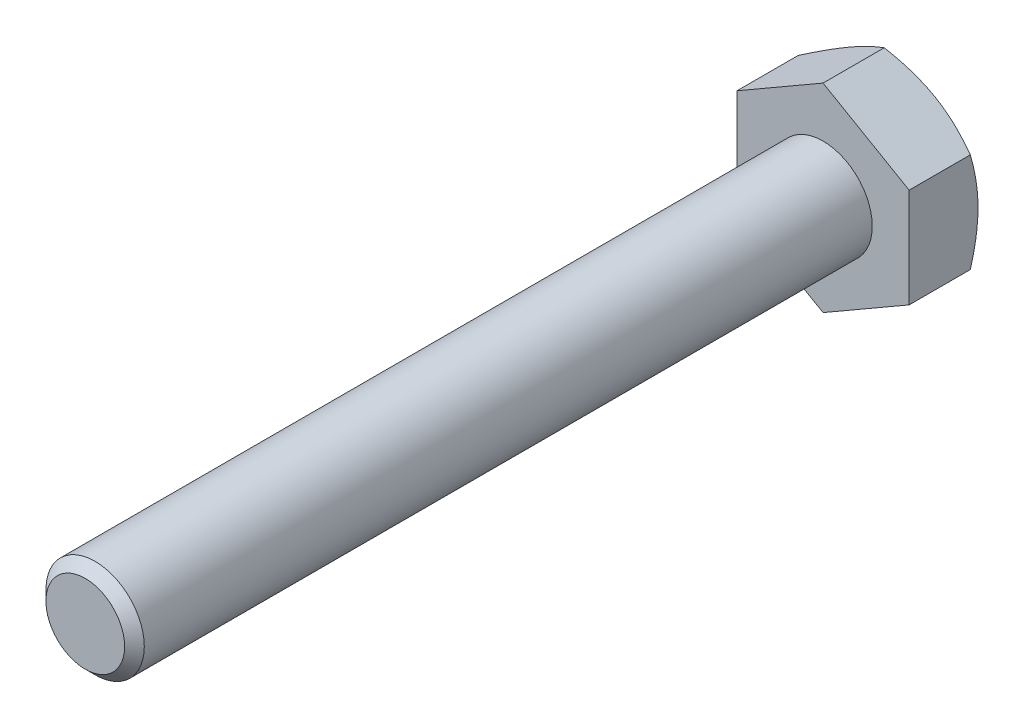
ISO-10303-21;
HEADER;
FILE_DESCRIPTION(('STEP AP214'),'2;1');
FILE_NAME('part.step','',(''),(''),'','','');
FILE_SCHEMA(('AUTOMOTIVE_DESIGN { 1 0 10303 214 1 1 1 1 }'));
ENDSEC;
DATA;
#1=APPLICATION_CONTEXT('core data for automotive mechanical design processes');
#2=APPLICATION_PROTOCOL_DEFINITION('international standard','automotive_design',2000,#1);
#3=PRODUCT_CONTEXT('',#1,'mechanical');
#4=PRODUCT('Part','Part','',(#3));
#5=PRODUCT_RELATED_PRODUCT_CATEGORY('part','',(#4));
#6=PRODUCT_DEFINITION_FORMATION('','',#4);
#7=PRODUCT_DEFINITION_CONTEXT('part definition',#1,'design');
#8=PRODUCT_DEFINITION('design','',#6,#7);
#9=PRODUCT_DEFINITION_SHAPE('','',#8);
#10=(LENGTH_UNIT() NAMED_UNIT(*) SI_UNIT(.MILLI.,.METRE.));
#11=(NAMED_UNIT(*) PLANE_ANGLE_UNIT() SI_UNIT($,.RADIAN.));
#12=(NAMED_UNIT(*) SI_UNIT($,.STERADIAN.) SOLID_ANGLE_UNIT());
#13=UNCERTAINTY_MEASURE_WITH_UNIT(LENGTH_MEASURE(1.E-05),#10,'distance_accuracy_value','');
#14=(GEOMETRIC_REPRESENTATION_CONTEXT(3) GLOBAL_UNCERTAINTY_ASSIGNED_CONTEXT((#13)) GLOBAL_UNIT_ASSIGNED_CONTEXT((#10,
#11,#12)) REPRESENTATION_CONTEXT('',''));
#15=CARTESIAN_POINT('',(0.,0.,0.));
#16=DIRECTION('',(0.,0.,1.));
#17=DIRECTION('',(1.,0.,0.));
#18=AXIS2_PLACEMENT_3D('',#15,#16,#17);
#19=CARTESIAN_POINT('',(0.,0.,30.));
#20=DIRECTION('',(0.,0.,1.));
#21=DIRECTION('',(1.,0.,0.));
#22=AXIS2_PLACEMENT_3D('',#19,#20,#21);
#23=PLANE('',#22);
#24=CARTESIAN_POINT('',(0.,0.,30.));
#25=DIRECTION('',(0.,0.,1.));
#26=DIRECTION('',(1.,0.,0.));
#27=AXIS2_PLACEMENT_3D('',#24,#25,#26);
#28=CIRCLE('',#27,1.6);
#29=CARTESIAN_POINT('',(1.6,0.,30.));
#30=VERTEX_POINT('',#29);
#31=EDGE_CURVE('E269',#30,#30,#28,.T.);
#32=ORIENTED_EDGE('',*,*,#31,.T.);
#33=EDGE_LOOP('',(#32));
#34=FACE_BOUND('',#33,.T.);
#35=ADVANCED_FACE('F32',(#34),#23,.T.);
#36=CARTESIAN_POINT('',(0.,0.,0.));
#37=DIRECTION('',(0.,0.,1.));
#38=DIRECTION('',(1.,0.,0.));
#39=AXIS2_PLACEMENT_3D('',#36,#37,#38);
#40=CYLINDRICAL_SURFACE('',#39,2.);
#41=CARTESIAN_POINT('',(0.,0.,29.6));
#42=DIRECTION('',(0.,0.,1.));
#43=DIRECTION('',(1.,0.,0.));
#44=AXIS2_PLACEMENT_3D('',#41,#42,#43);
#45=CIRCLE('',#44,2.);
#46=CARTESIAN_POINT('',(2.,0.,29.6));
#47=VERTEX_POINT('',#46);
#48=EDGE_CURVE('E240',#47,#47,#45,.F.);
#49=ORIENTED_EDGE('',*,*,#48,.T.);
#50=EDGE_LOOP('',(#49));
#51=FACE_BOUND('',#50,.T.);
#52=CARTESIAN_POINT('',(0.,0.,0.));
#53=DIRECTION('',(0.,0.,1.));
#54=DIRECTION('',(1.,0.,0.));
#55=AXIS2_PLACEMENT_3D('',#52,#53,#54);
#56=CIRCLE('',#55,2.);
#57=CARTESIAN_POINT('',(2.,0.,0.));
#58=VERTEX_POINT('',#57);
#59=EDGE_CURVE('E266',#58,#58,#56,.F.);
#60=ORIENTED_EDGE('',*,*,#59,.F.);
#61=EDGE_LOOP('',(#60));
#62=FACE_BOUND('',#61,.T.);
#63=ADVANCED_FACE('F204',(#51,#62),#40,.T.);
#64=CARTESIAN_POINT('',(0.,0.,30.));
#65=DIRECTION('',(0.,0.,-1.));
#66=DIRECTION('',(-1.,0.,0.));
#67=AXIS2_PLACEMENT_3D('',#64,#65,#66);
#68=CONICAL_SURFACE('',#67,1.6,0.785398163397445);
#69=ORIENTED_EDGE('',*,*,#48,.F.);
#70=EDGE_LOOP('',(#69));
#71=FACE_BOUND('',#70,.T.);
#72=ORIENTED_EDGE('',*,*,#31,.F.);
#73=EDGE_LOOP('',(#72));
#74=FACE_BOUND('',#73,.T.);
#75=ADVANCED_FACE('F34',(#71,#74),#68,.T.);
#76=CARTESIAN_POINT('',(0.,4.04145188432739,-2.8));
#77=DIRECTION('',(0.499999999999998,0.86602540378444,0.));
#78=DIRECTION('',(-0.86602540378444,0.499999999999998,0.));
#79=AXIS2_PLACEMENT_3D('',#76,#77,#78);
#80=PLANE('',#79);
#81=CARTESIAN_POINT('',(-0.000200000000018282,4.04156735438123,-2.48732593930663));
#82=CARTESIAN_POINT('',(0.153607178452432,3.95276673849841,-2.53861421101001));
#83=CARTESIAN_POINT('',(0.308742010834407,3.86319960126199,-2.5852590461838));
#84=CARTESIAN_POINT('',(0.621698006576765,3.68251437287563,-2.66667812446665));
#85=CARTESIAN_POINT('',(0.779524730787481,3.59139307116726,-2.70142356441544));
#86=CARTESIAN_POINT('',(1.09322221038011,3.41027974688035,-2.75550997281716));
#87=CARTESIAN_POINT('',(1.24904469916068,3.32031559103709,-2.77521091373962));
#88=CARTESIAN_POINT('',(1.56142288720536,3.13996396008053,-2.79872986726275));
#89=CARTESIAN_POINT('',(1.71797745103422,3.04957714051107,-2.80256735545444));
#90=CARTESIAN_POINT('',(2.01050921992098,2.88068384499778,-2.79458469812302));
#91=CARTESIAN_POINT('',(2.1465302124579,2.80215208834115,-2.78472456593039));
#92=CARTESIAN_POINT('',(2.41768602028899,2.64560020969754,-2.7534735331006));
#93=CARTESIAN_POINT('',(2.55281989768468,2.56758062920651,-2.7320719567142));
#94=CARTESIAN_POINT('',(2.82453479240518,2.41070596159679,-2.67856959211942));
#95=CARTESIAN_POINT('',(2.96108141927833,2.33187072981464,-2.64624200555491));
#96=CARTESIAN_POINT('',(3.2321380929445,2.17537608630784,-2.57287106619201));
#97=CARTESIAN_POINT('',(3.36665161246854,2.09771466960099,-2.53184495343013));
#98=CARTESIAN_POINT('',(3.5002,2.02061047210986,-2.48732593930663));
#99=B_SPLINE_CURVE_WITH_KNOTS('',3,(#81,#82,#83,#84,#85,#86,#87,#88,#89,#90,#91,#92,#93,#94,#95,
#96,#97,#98),.UNSPECIFIED.,.F.,.F.,(4,2,2,2,2,2,2,2,4),(0.,0.554793832886255,1.11092123814984,
1.65328467083219,2.19498204478404,2.66665130850861,3.13875761298269,3.62133612600511,
4.10296698719189),.UNSPECIFIED.);
#100=CARTESIAN_POINT('',(0.,4.04145188432739,-2.48739260883035));
#101=VERTEX_POINT('',#100);
#102=CARTESIAN_POINT('',(1.74999999999999,3.03108891324554,-2.8));
#103=VERTEX_POINT('',#102);
#104=EDGE_CURVE('E228',#101,#103,#99,.T.);
#105=ORIENTED_EDGE('',*,*,#104,.F.);
#106=DIRECTION('',(0.,0.,1.));
#107=VECTOR('',#106,1.);
#108=CARTESIAN_POINT('',(0.,4.04145188432739,-2.8));
#109=LINE('',#108,#107);
#110=CARTESIAN_POINT('',(0.,4.04145188432739,0.));
#111=VERTEX_POINT('',#110);
#112=EDGE_CURVE('E225',#101,#111,#109,.T.);
#113=ORIENTED_EDGE('',*,*,#112,.T.);
#114=DIRECTION('',(-0.86602540378444,0.499999999999998,0.));
#115=VECTOR('',#114,1.);
#116=CARTESIAN_POINT('',(0.,4.04145188432739,0.));
#117=LINE('',#116,#115);
#118=CARTESIAN_POINT('',(3.5,2.0207259421637,0.));
#119=VERTEX_POINT('',#118);
#120=EDGE_CURVE('E233',#119,#111,#117,.T.);
#121=ORIENTED_EDGE('',*,*,#120,.F.);
#122=DIRECTION('',(0.,0.,1.));
#123=VECTOR('',#122,1.);
#124=CARTESIAN_POINT('',(3.5,2.0207259421637,-2.8));
#125=LINE('',#124,#123);
#126=CARTESIAN_POINT('',(3.5,2.0207259421637,-2.48739260883035));
#127=VERTEX_POINT('',#126);
#128=EDGE_CURVE('E258',#127,#119,#125,.T.);
#129=ORIENTED_EDGE('',*,*,#128,.F.);
#130=EDGE_CURVE('E177',#103,#127,#99,.T.);
#131=ORIENTED_EDGE('',*,*,#130,.F.);
#132=EDGE_LOOP('',(#105,#113,#121,#129,#131));
#133=FACE_BOUND('',#132,.T.);
#134=ADVANCED_FACE('F188',(#133),#80,.T.);
#135=CARTESIAN_POINT('',(3.5,-2.0207259421637,-2.8));
#136=DIRECTION('',(1.,0.,0.));
#137=DIRECTION('',(0.,0.,-1.));
#138=AXIS2_PLACEMENT_3D('',#135,#136,#137);
#139=PLANE('',#138);
#140=CARTESIAN_POINT('',(3.5,-5.5115599132137,-1.05123027842014));
#141=CARTESIAN_POINT('',(3.5,-5.35795146168121,-1.12607664094827));
#142=CARTESIAN_POINT('',(3.5,-5.20399921009229,-1.20022907517413));
#143=CARTESIAN_POINT('',(3.5,-4.89522454872942,-1.34675734914902));
#144=CARTESIAN_POINT('',(3.5,-4.74040201352888,-1.41913292430435));
#145=CARTESIAN_POINT('',(3.5,-4.42894615034129,-1.56206506717812));
#146=CARTESIAN_POINT('',(3.5,-4.27230759822603,-1.63261028917771));
#147=CARTESIAN_POINT('',(3.5,-3.95781335182267,-1.77092284895817));
#148=CARTESIAN_POINT('',(3.5,-3.79995771311103,-1.83869031269911));
#149=CARTESIAN_POINT('',(3.5,-3.47741113153966,-1.97295074269912));
#150=CARTESIAN_POINT('',(3.5,-3.31266966015408,-2.03932296039635));
#151=CARTESIAN_POINT('',(3.5,-2.98129055183975,-2.16724360933954));
#152=CARTESIAN_POINT('',(3.5,-2.81465270912935,-2.22879151125521));
#153=CARTESIAN_POINT('',(3.5,-2.47950135030689,-2.34550906477687));
#154=CARTESIAN_POINT('',(3.5,-2.31099212862996,-2.40069092778852));
#155=CARTESIAN_POINT('',(3.5,-1.9715578800388,-2.50296137699356));
#156=CARTESIAN_POINT('',(3.5,-1.80063360505408,-2.55005242468974));
#157=CARTESIAN_POINT('',(3.5,-1.45721769418154,-2.63368726814516));
#158=CARTESIAN_POINT('',(3.5,-1.284740691287,-2.67029006719255));
#159=CARTESIAN_POINT('',(3.5,-0.937557025087316,-2.73093355614778));
#160=CARTESIAN_POINT('',(3.5,-0.762850606367499,-2.75497561213941));
#161=CARTESIAN_POINT('',(3.5,-0.41439625684188,-2.78826920086828));
#162=CARTESIAN_POINT('',(3.5,-0.24066759256781,-2.79771739417793));
#163=CARTESIAN_POINT('',(3.5,0.106974360360036,-2.80154556659445));
#164=CARTESIAN_POINT('',(3.5,0.280887651698044,-2.7959253235422));
#165=CARTESIAN_POINT('',(3.5,0.57367772999446,-2.77418399451728));
#166=CARTESIAN_POINT('',(3.5,0.692856453275199,-2.76187051371579));
#167=CARTESIAN_POINT('',(3.5,0.930390570440087,-2.73088957270953));
#168=CARTESIAN_POINT('',(3.5,1.04874585973469,-2.71222131985519));
#169=CARTESIAN_POINT('',(3.5,1.40238821087656,-2.64766060469304));
#170=CARTESIAN_POINT('',(3.5,1.636135180366,-2.59322203585637));
#171=CARTESIAN_POINT('',(3.5,1.98584040729011,-2.49818174698124));
#172=CARTESIAN_POINT('',(3.5,2.10359260573205,-2.46379952268766));
#173=CARTESIAN_POINT('',(3.5,2.3379545290403,-2.39130577472369));
#174=CARTESIAN_POINT('',(3.5,2.45456424508592,-2.35319422228545));
#175=CARTESIAN_POINT('',(3.5,2.68667648503228,-2.27386649986118));
#176=CARTESIAN_POINT('',(3.5,2.80217931014601,-2.23265120318029));
#177=CARTESIAN_POINT('',(3.5,3.0322162217769,-2.14761668191578));
#178=CARTESIAN_POINT('',(3.5,3.14675033047978,-2.10379751715191));
#179=CARTESIAN_POINT('',(3.5,3.45518824474215,-1.98241358076653));
#180=CARTESIAN_POINT('',(3.5,3.64827858337665,-1.90278371704724));
#181=CARTESIAN_POINT('',(3.5,4.03246733734996,-1.738838783469));
#182=CARTESIAN_POINT('',(3.5,4.22356552793095,-1.6545231916082));
#183=CARTESIAN_POINT('',(3.5,4.60422080078615,-1.48231977624898));
#184=CARTESIAN_POINT('',(3.5,4.79377731975278,-1.3944307117281));
#185=CARTESIAN_POINT('',(3.5,5.17160542987793,-1.21592705795529));
#186=CARTESIAN_POINT('',(3.5,5.35987698121651,-1.12531238470558));
#187=CARTESIAN_POINT('',(3.5,5.73567568183911,-0.941812491523437));
#188=CARTESIAN_POINT('',(3.5,5.92320119040395,-0.848923918398865));
#189=CARTESIAN_POINT('',(3.5,6.29740401332882,-0.661451949679656));
#190=CARTESIAN_POINT('',(3.5,6.4840813186156,-0.566868536008528));
#191=CARTESIAN_POINT('',(3.5,7.04299370579127,-0.281137350976761));
#192=CARTESIAN_POINT('',(3.5,7.41419418594083,-0.0879667587069206));
#193=CARTESIAN_POINT('',(3.5,8.1154529737333,0.28131090771229));
#194=CARTESIAN_POINT('',(3.5,8.44570240603792,0.457056799003233));
#195=CARTESIAN_POINT('',(3.5,9.10509095269334,0.810667080198443));
#196=CARTESIAN_POINT('',(3.5,9.4342299968145,0.988531600993423));
#197=CARTESIAN_POINT('',(3.5,10.0905480448887,1.34522643131465));
#198=CARTESIAN_POINT('',(3.5,10.4177299168719,1.52405147197681));
#199=CARTESIAN_POINT('',(3.5,11.0714005801046,1.88290305302714));
#200=CARTESIAN_POINT('',(3.5,11.397889424295,2.06292949694077));
#201=CARTESIAN_POINT('',(3.5,11.7241348717818,2.24339321716844));
#202=B_SPLINE_CURVE_WITH_KNOTS('',3,(#140,#141,#142,#143,#144,#145,#146,#147,#148,#149,#150,
#151,#152,#153,#154,#155,#156,#157,#158,#159,#160,#161,#162,#163,#164,#165,#166,#167,#168,#169,
#170,#171,#172,#173,#174,#175,#176,#177,#178,#179,#180,#181,#182,#183,#184,#185,#186,#187,#188,
#189,#190,#191,#192,#193,#194,#195,#196,#197,#198,#199,#200,#201),.UNSPECIFIED.,.F.,.F.,(4,2,2,
2,2,2,2,2,2,2,2,2,2,2,2,2,2,2,2,2,2,2,2,2,2,2,2,2,2,2,4),(0.,0.512624455055139,1.02532478807014,
1.54067716579031,2.05600614845994,2.58877526662743,3.12160275933497,3.65339055670451,
4.18501627844404,4.71358974605645,5.24210571499797,5.76343550148058,6.28477297414903,
6.64403977227188,7.00335139923845,7.72232402023062,8.09029789782061,8.45827461416728,
8.82614817645966,9.19401329070559,9.82051720102626,10.4470910459092,11.0738843824793,
11.7006970553932,12.3284975462801,12.9563047370264,14.2116350789245,15.333929259245,
16.4562931392235,17.5748776783279,18.6933734490332),.UNSPECIFIED.);
#203=CARTESIAN_POINT('',(3.5,0.,-2.8));
#204=VERTEX_POINT('',#203);
#205=EDGE_CURVE('E175',#127,#204,#202,.F.);
#206=ORIENTED_EDGE('',*,*,#205,.F.);
#207=ORIENTED_EDGE('',*,*,#128,.T.);
#208=DIRECTION('',(0.,1.,0.));
#209=VECTOR('',#208,1.);
#210=CARTESIAN_POINT('',(3.5,-2.0207259421637,0.));
#211=LINE('',#210,#209);
#212=CARTESIAN_POINT('',(3.5,-2.0207259421637,0.));
#213=VERTEX_POINT('',#212);
#214=EDGE_CURVE('E265',#213,#119,#211,.T.);
#215=ORIENTED_EDGE('',*,*,#214,.F.);
#216=DIRECTION('',(0.,0.,1.));
#217=VECTOR('',#216,1.);
#218=CARTESIAN_POINT('',(3.5,-2.0207259421637,-2.8));
#219=LINE('',#218,#217);
#220=CARTESIAN_POINT('',(3.5,-2.0207259421637,-2.48739260883036));
#221=VERTEX_POINT('',#220);
#222=EDGE_CURVE('E243',#221,#213,#219,.T.);
#223=ORIENTED_EDGE('',*,*,#222,.F.);
#224=EDGE_CURVE('E169',#204,#221,#202,.F.);
#225=ORIENTED_EDGE('',*,*,#224,.F.);
#226=EDGE_LOOP('',(#206,#207,#215,#223,#225));
#227=FACE_BOUND('',#226,.T.);
#228=ADVANCED_FACE('F184',(#227),#139,.T.);
#229=CARTESIAN_POINT('',(0.,-4.04145188432739,-2.8));
#230=DIRECTION('',(0.499999999999998,-0.86602540378444,0.));
#231=DIRECTION('',(0.86602540378444,0.499999999999998,0.));
#232=AXIS2_PLACEMENT_3D('',#229,#230,#231);
#233=PLANE('',#232);
#234=CARTESIAN_POINT('',(3.5002,-2.02061047210986,-2.48732593930663));
#235=CARTESIAN_POINT('',(3.34639282154755,-2.10941108799268,-2.53861421101002));
#236=CARTESIAN_POINT('',(3.19125798916558,-2.1989782252291,-2.5852590461838));
#237=CARTESIAN_POINT('',(2.87830199342322,-2.37966345361546,-2.66667812446665));
#238=CARTESIAN_POINT('',(2.7204752692125,-2.47078475532383,-2.70142356441544));
#239=CARTESIAN_POINT('',(2.40677778961987,-2.65189807961074,-2.75550997281716));
#240=CARTESIAN_POINT('',(2.25095530083931,-2.741862235454,-2.77521091373962));
#241=CARTESIAN_POINT('',(1.93857711279462,-2.92221386641056,-2.79872986726275));
#242=CARTESIAN_POINT('',(1.78202254896577,-3.01260068598002,-2.80256735545444));
#243=CARTESIAN_POINT('',(1.48949078007901,-3.1814939814933,-2.79458469812302));
#244=CARTESIAN_POINT('',(1.35346978754209,-3.26002573814993,-2.78472456593039));
#245=CARTESIAN_POINT('',(1.082313979711,-3.41657761679354,-2.7534735331006));
#246=CARTESIAN_POINT('',(0.947180102315307,-3.49459719728458,-2.7320719567142));
#247=CARTESIAN_POINT('',(0.675465207594804,-3.65147186489429,-2.67856959211942));
#248=CARTESIAN_POINT('',(0.538918580721651,-3.73030709667644,-2.64624200555491));
#249=CARTESIAN_POINT('',(0.267861907055482,-3.88680174018325,-2.572871066192));
#250=CARTESIAN_POINT('',(0.133348387531446,-3.9644631568901,-2.53184495343013));
#251=CARTESIAN_POINT('',(-0.00020000000001818,-4.04156735438123,-2.48732593930663));
#252=B_SPLINE_CURVE_WITH_KNOTS('',3,(#234,#235,#236,#237,#238,#239,#240,#241,#242,#243,#244,
#245,#246,#247,#248,#249,#250,#251),.UNSPECIFIED.,.F.,.F.,(4,2,2,2,2,2,2,2,4),(0.,
0.554793832886255,1.11092123814984,1.65328467083219,2.19498204478404,2.66665130850861,
3.13875761298269,3.62133612600511,4.10296698719189),.UNSPECIFIED.);
#253=CARTESIAN_POINT('',(1.74999999999999,-3.03108891324554,-2.8));
#254=VERTEX_POINT('',#253);
#255=EDGE_CURVE('E176',#221,#254,#252,.T.);
#256=ORIENTED_EDGE('',*,*,#255,.F.);
#257=ORIENTED_EDGE('',*,*,#222,.T.);
#258=DIRECTION('',(0.86602540378444,0.499999999999998,0.));
#259=VECTOR('',#258,1.);
#260=CARTESIAN_POINT('',(0.,-4.04145188432739,0.));
#261=LINE('',#260,#259);
#262=CARTESIAN_POINT('',(0.,-4.04145188432739,0.));
#263=VERTEX_POINT('',#262);
#264=EDGE_CURVE('E254',#263,#213,#261,.T.);
#265=ORIENTED_EDGE('',*,*,#264,.F.);
#266=DIRECTION('',(0.,0.,1.));
#267=VECTOR('',#266,1.);
#268=CARTESIAN_POINT('',(0.,-4.04145188432739,-2.8));
#269=LINE('',#268,#267);
#270=CARTESIAN_POINT('',(0.,-4.04145188432739,-2.48739260883035));
#271=VERTEX_POINT('',#270);
#272=EDGE_CURVE('E253',#271,#263,#269,.T.);
#273=ORIENTED_EDGE('',*,*,#272,.F.);
#274=EDGE_CURVE('E162',#254,#271,#252,.T.);
#275=ORIENTED_EDGE('',*,*,#274,.F.);
#276=EDGE_LOOP('',(#256,#257,#265,#273,#275));
#277=FACE_BOUND('',#276,.T.);
#278=ADVANCED_FACE('F187',(#277),#233,.T.);
#279=CARTESIAN_POINT('',(0.,-4.04145188432739,-2.8));
#280=DIRECTION('',(-0.500000000000002,-0.866025403784438,0.));
#281=DIRECTION('',(0.866025403784438,-0.500000000000002,0.));
#282=AXIS2_PLACEMENT_3D('',#279,#280,#281);
#283=PLANE('',#282);
#284=CARTESIAN_POINT('',(0.000199999999981852,-4.04156735438123,-2.48732593930663));
#285=CARTESIAN_POINT('',(-0.153607178452468,-3.95276673849841,-2.53861421101001));
#286=CARTESIAN_POINT('',(-0.308742010834443,-3.86319960126199,-2.5852590461838));
#287=CARTESIAN_POINT('',(-0.621698006576801,-3.68251437287563,-2.66667812446665));
#288=CARTESIAN_POINT('',(-0.779524730787515,-3.59139307116725,-2.70142356441544));
#289=CARTESIAN_POINT('',(-1.09322221038015,-3.41027974688034,-2.75550997281716));
#290=CARTESIAN_POINT('',(-1.24904469916071,-3.32031559103708,-2.77521091373962));
#291=CARTESIAN_POINT('',(-1.56142288720539,-3.13996396008052,-2.79872986726274));
#292=CARTESIAN_POINT('',(-1.71797745103425,-3.04957714051106,-2.80256735545443));
#293=CARTESIAN_POINT('',(-2.01050921992101,-2.88068384499777,-2.79458469812302));
#294=CARTESIAN_POINT('',(-2.14653021245793,-2.80215208834115,-2.78472456593039));
#295=CARTESIAN_POINT('',(-2.41768602028901,-2.64560020969754,-2.75347353310059));
#296=CARTESIAN_POINT('',(-2.5528198976847,-2.5675806292065,-2.7320719567142));
#297=CARTESIAN_POINT('',(-2.8245347924052,-2.41070596159679,-2.67856959211942));
#298=CARTESIAN_POINT('',(-2.96108141927835,-2.33187072981464,-2.64624200555491));
#299=CARTESIAN_POINT('',(-3.23213809294451,-2.17537608630784,-2.572871066192));
#300=CARTESIAN_POINT('',(-3.36665161246854,-2.09771466960099,-2.53184495343013));
#301=CARTESIAN_POINT('',(-3.5002,-2.02061047210986,-2.48732593930663));
#302=B_SPLINE_CURVE_WITH_KNOTS('',3,(#284,#285,#286,#287,#288,#289,#290,#291,#292,#293,#294,
#295,#296,#297,#298,#299,#300,#301),.UNSPECIFIED.,.F.,.F.,(4,2,2,2,2,2,2,2,4),(0.,
0.554793832886255,1.11092123814984,1.65328467083219,2.19498204478404,2.6666513085086,
3.13875761298267,3.62133612600509,4.10296698719186),.UNSPECIFIED.);
#303=CARTESIAN_POINT('',(-1.75000000000001,-3.03108891324553,-2.8));
#304=VERTEX_POINT('',#303);
#305=EDGE_CURVE('E249',#271,#304,#302,.T.);
#306=ORIENTED_EDGE('',*,*,#305,.F.);
#307=ORIENTED_EDGE('',*,*,#272,.T.);
#308=DIRECTION('',(0.866025403784438,-0.500000000000002,0.));
#309=VECTOR('',#308,1.);
#310=CARTESIAN_POINT('',(0.,-4.04145188432739,0.));
#311=LINE('',#310,#309);
#312=CARTESIAN_POINT('',(-3.5,-2.0207259421637,0.));
#313=VERTEX_POINT('',#312);
#314=EDGE_CURVE('E387',#313,#263,#311,.T.);
#315=ORIENTED_EDGE('',*,*,#314,.F.);
#316=DIRECTION('',(0.,0.,1.));
#317=VECTOR('',#316,1.);
#318=CARTESIAN_POINT('',(-3.5,-2.0207259421637,-2.8));
#319=LINE('',#318,#317);
#320=CARTESIAN_POINT('',(-3.5,-2.02072594216386,-2.48739260883046));
#321=VERTEX_POINT('',#320);
#322=EDGE_CURVE('E256',#321,#313,#319,.T.);
#323=ORIENTED_EDGE('',*,*,#322,.F.);
#324=EDGE_CURVE('E109',#304,#321,#302,.T.);
#325=ORIENTED_EDGE('',*,*,#324,.F.);
#326=EDGE_LOOP('',(#306,#307,#315,#323,#325));
#327=FACE_BOUND('',#326,.T.);
#328=ADVANCED_FACE('F193',(#327),#283,.T.);
#329=CARTESIAN_POINT('',(-3.5,-2.0207259421637,-2.8));
#330=DIRECTION('',(-1.,0.,0.));
#331=DIRECTION('',(0.,0.,1.));
#332=AXIS2_PLACEMENT_3D('',#329,#330,#331);
#333=PLANE('',#332);
#334=CARTESIAN_POINT('',(-3.5,-5.5115599132137,-1.05123027842014));
#335=CARTESIAN_POINT('',(-3.5,-5.35795146168121,-1.12607664094827));
#336=CARTESIAN_POINT('',(-3.5,-5.20399921009229,-1.20022907517413));
#337=CARTESIAN_POINT('',(-3.5,-4.89522454872942,-1.34675734914902));
#338=CARTESIAN_POINT('',(-3.5,-4.74040201352888,-1.41913292430435));
#339=CARTESIAN_POINT('',(-3.5,-4.42894615034129,-1.56206506717813));
#340=CARTESIAN_POINT('',(-3.5,-4.27230759822603,-1.63261028917771));
#341=CARTESIAN_POINT('',(-3.5,-3.95781335182267,-1.77092284895817));
#342=CARTESIAN_POINT('',(-3.5,-3.79995771311103,-1.83869031269911));
#343=CARTESIAN_POINT('',(-3.5,-3.47741113153966,-1.97295074269912));
#344=CARTESIAN_POINT('',(-3.5,-3.31266966015408,-2.03932296039635));
#345=CARTESIAN_POINT('',(-3.5,-2.98129055183975,-2.16724360933954));
#346=CARTESIAN_POINT('',(-3.5,-2.81465270912935,-2.22879151125521));
#347=CARTESIAN_POINT('',(-3.5,-2.47950135030689,-2.34550906477687));
#348=CARTESIAN_POINT('',(-3.5,-2.31099212862996,-2.40069092778851));
#349=CARTESIAN_POINT('',(-3.5,-1.9715578800388,-2.50296137699356));
#350=CARTESIAN_POINT('',(-3.5,-1.80063360505408,-2.55005242468974));
#351=CARTESIAN_POINT('',(-3.5,-1.45721769418154,-2.63368726814516));
#352=CARTESIAN_POINT('',(-3.5,-1.284740691287,-2.67029006719254));
#353=CARTESIAN_POINT('',(-3.5,-0.937557025087316,-2.73093355614778));
#354=CARTESIAN_POINT('',(-3.5,-0.7628506063675,-2.75497561213941));
#355=CARTESIAN_POINT('',(-3.5,-0.41439625684188,-2.78826920086828));
#356=CARTESIAN_POINT('',(-3.5,-0.240667592567811,-2.79771739417793));
#357=CARTESIAN_POINT('',(-3.5,0.106974360360035,-2.80154556659445));
#358=CARTESIAN_POINT('',(-3.5,0.280887651698044,-2.7959253235422));
#359=CARTESIAN_POINT('',(-3.5,0.573677729994459,-2.77418399451728));
#360=CARTESIAN_POINT('',(-3.5,0.692856453275198,-2.76187051371579));
#361=CARTESIAN_POINT('',(-3.5,0.930390570440087,-2.73088957270953));
#362=CARTESIAN_POINT('',(-3.5,1.04874585973469,-2.71222131985519));
#363=CARTESIAN_POINT('',(-3.5,1.40238821087656,-2.64766060469304));
#364=CARTESIAN_POINT('',(-3.5,1.636135180366,-2.59322203585637));
#365=CARTESIAN_POINT('',(-3.5,1.98584040729011,-2.49818174698124));
#366=CARTESIAN_POINT('',(-3.5,2.10359260573205,-2.46379952268766));
#367=CARTESIAN_POINT('',(-3.5,2.3379545290403,-2.39130577472369));
#368=CARTESIAN_POINT('',(-3.5,2.45456424508592,-2.35319422228545));
#369=CARTESIAN_POINT('',(-3.5,2.68667648503228,-2.27386649986119));
#370=CARTESIAN_POINT('',(-3.5,2.80217931014601,-2.23265120318029));
#371=CARTESIAN_POINT('',(-3.5,3.0322162217769,-2.14761668191579));
#372=CARTESIAN_POINT('',(-3.5,3.14675033047978,-2.10379751715191));
#373=CARTESIAN_POINT('',(-3.5,3.45518824474215,-1.98241358076653));
#374=CARTESIAN_POINT('',(-3.5,3.64827858337665,-1.90278371704724));
#375=CARTESIAN_POINT('',(-3.5,4.03246733734996,-1.738838783469));
#376=CARTESIAN_POINT('',(-3.5,4.22356552793095,-1.6545231916082));
#377=CARTESIAN_POINT('',(-3.5,4.60422080078615,-1.48231977624898));
#378=CARTESIAN_POINT('',(-3.5,4.79377731975278,-1.3944307117281));
#379=CARTESIAN_POINT('',(-3.5,5.17160542987793,-1.21592705795529));
#380=CARTESIAN_POINT('',(-3.5,5.3598769812165,-1.12531238470558));
#381=CARTESIAN_POINT('',(-3.5,5.7356756818391,-0.941812491523439));
#382=CARTESIAN_POINT('',(-3.5,5.92320119040394,-0.848923918398866));
#383=CARTESIAN_POINT('',(-3.5,6.29740401332881,-0.661451949679658));
#384=CARTESIAN_POINT('',(-3.5,6.4840813186156,-0.566868536008529));
#385=CARTESIAN_POINT('',(-3.5,7.04299370579126,-0.281137350976762));
#386=CARTESIAN_POINT('',(-3.5,7.41419418594082,-0.0879667587069218));
#387=CARTESIAN_POINT('',(-3.5,8.1154529737333,0.281310907712289));
#388=CARTESIAN_POINT('',(-3.5,8.44570240603792,0.457056799003232));
#389=CARTESIAN_POINT('',(-3.5,9.10509095269334,0.810667080198443));
#390=CARTESIAN_POINT('',(-3.5,9.4342299968145,0.988531600993422));
#391=CARTESIAN_POINT('',(-3.5,10.0905480448887,1.34522643131465));
#392=CARTESIAN_POINT('',(-3.5,10.4177299168718,1.52405147197681));
#393=CARTESIAN_POINT('',(-3.5,11.0714005801046,1.88290305302714));
#394=CARTESIAN_POINT('',(-3.5,11.397889424295,2.06292949694077));
#395=CARTESIAN_POINT('',(-3.5,11.7241348717818,2.24339321716844));
#396=B_SPLINE_CURVE_WITH_KNOTS('',3,(#334,#335,#336,#337,#338,#339,#340,#341,#342,#343,#344,
#345,#346,#347,#348,#349,#350,#351,#352,#353,#354,#355,#356,#357,#358,#359,#360,#361,#362,#363,
#364,#365,#366,#367,#368,#369,#370,#371,#372,#373,#374,#375,#376,#377,#378,#379,#380,#381,#382,
#383,#384,#385,#386,#387,#388,#389,#390,#391,#392,#393,#394,#395),.UNSPECIFIED.,.F.,.F.,(4,2,2,
2,2,2,2,2,2,2,2,2,2,2,2,2,2,2,2,2,2,2,2,2,2,2,2,2,2,2,4),(0.,0.51262445505514,1.02532478807014,
1.54067716579031,2.05600614845994,2.58877526662743,3.12160275933497,3.65339055670451,
4.18501627844404,4.71358974605645,5.24210571499797,5.76343550148057,6.28477297414903,
6.64403977227187,7.00335139923845,7.72232402023061,8.0902978978206,8.45827461416728,
8.82614817645965,9.19401329070559,9.82051720102626,10.4470910459092,11.0738843824793,
11.7006970553932,12.3284975462801,12.9563047370264,14.2116350789245,15.333929259245,
16.4562931392235,17.5748776783279,18.6933734490332),.UNSPECIFIED.);
#397=CARTESIAN_POINT('',(-3.5,0.,-2.8));
#398=VERTEX_POINT('',#397);
#399=EDGE_CURVE('E104',#321,#398,#396,.T.);
#400=ORIENTED_EDGE('',*,*,#399,.F.);
#401=ORIENTED_EDGE('',*,*,#322,.T.);
#402=DIRECTION('',(0.,-1.,0.));
#403=VECTOR('',#402,1.);
#404=CARTESIAN_POINT('',(-3.5,-2.0207259421637,0.));
#405=LINE('',#404,#403);
#406=CARTESIAN_POINT('',(-3.5,2.0207259421637,0.));
#407=VERTEX_POINT('',#406);
#408=EDGE_CURVE('E389',#407,#313,#405,.T.);
#409=ORIENTED_EDGE('',*,*,#408,.F.);
#410=DIRECTION('',(0.,0.,1.));
#411=VECTOR('',#410,1.);
#412=CARTESIAN_POINT('',(-3.5,2.0207259421637,-2.8));
#413=LINE('',#412,#411);
#414=CARTESIAN_POINT('',(-3.5,2.0207259421637,-2.48739260883035));
#415=VERTEX_POINT('',#414);
#416=EDGE_CURVE('E130',#415,#407,#413,.T.);
#417=ORIENTED_EDGE('',*,*,#416,.F.);
#418=EDGE_CURVE('E113',#398,#415,#396,.T.);
#419=ORIENTED_EDGE('',*,*,#418,.F.);
#420=EDGE_LOOP('',(#400,#401,#409,#417,#419));
#421=FACE_BOUND('',#420,.T.);
#422=ADVANCED_FACE('F128',(#421),#333,.T.);
#423=CARTESIAN_POINT('',(-3.5,2.0207259421637,-2.8));
#424=DIRECTION('',(-0.500000000000002,0.866025403784438,0.));
#425=DIRECTION('',(-0.866025403784438,-0.500000000000002,0.));
#426=AXIS2_PLACEMENT_3D('',#423,#424,#425);
#427=PLANE('',#426);
#428=CARTESIAN_POINT('',(-3.5002,2.02061047210986,-2.48732593930663));
#429=CARTESIAN_POINT('',(-3.34639282154755,2.10941108799268,-2.53861421101001));
#430=CARTESIAN_POINT('',(-3.19125798916558,2.1989782252291,-2.5852590461838));
#431=CARTESIAN_POINT('',(-2.87830199342322,2.37966345361546,-2.66667812446665));
#432=CARTESIAN_POINT('',(-2.72047526921251,2.47078475532383,-2.70142356441544));
#433=CARTESIAN_POINT('',(-2.40677778961987,2.65189807961075,-2.75550997281716));
#434=CARTESIAN_POINT('',(-2.25095530083931,2.741862235454,-2.77521091373962));
#435=CARTESIAN_POINT('',(-1.93857711279463,2.92221386641057,-2.79872986726274));
#436=CARTESIAN_POINT('',(-1.78202254896577,3.01260068598002,-2.80256735545443));
#437=CARTESIAN_POINT('',(-1.48949078007901,3.18149398149331,-2.79458469812302));
#438=CARTESIAN_POINT('',(-1.3534697875421,3.26002573814994,-2.78472456593039));
#439=CARTESIAN_POINT('',(-1.08231397971101,3.41657761679355,-2.75347353310059));
#440=CARTESIAN_POINT('',(-0.947180102315325,3.49459719728459,-2.7320719567142));
#441=CARTESIAN_POINT('',(-0.675465207594827,3.6514718648943,-2.67856959211942));
#442=CARTESIAN_POINT('',(-0.538918580721677,3.73030709667645,-2.64624200555491));
#443=CARTESIAN_POINT('',(-0.267861907055514,3.88680174018325,-2.572871066192));
#444=CARTESIAN_POINT('',(-0.13334838753148,3.9644631568901,-2.53184495343013));
#445=CARTESIAN_POINT('',(0.000199999999981511,4.04156735438123,-2.48732593930663));
#446=B_SPLINE_CURVE_WITH_KNOTS('',3,(#428,#429,#430,#431,#432,#433,#434,#435,#436,#437,#438,
#439,#440,#441,#442,#443,#444,#445),.UNSPECIFIED.,.F.,.F.,(4,2,2,2,2,2,2,2,4),(0.,
0.554793832886256,1.11092123814984,1.65328467083219,2.19498204478403,2.6666513085086,
3.13875761298267,3.62133612600509,4.10296698719186),.UNSPECIFIED.);
#447=CARTESIAN_POINT('',(-1.75000000000001,3.03108891324554,-2.8));
#448=VERTEX_POINT('',#447);
#449=EDGE_CURVE('E119',#415,#448,#446,.T.);
#450=ORIENTED_EDGE('',*,*,#449,.F.);
#451=ORIENTED_EDGE('',*,*,#416,.T.);
#452=DIRECTION('',(-0.866025403784438,-0.500000000000002,0.));
#453=VECTOR('',#452,1.);
#454=CARTESIAN_POINT('',(-3.5,2.0207259421637,0.));
#455=LINE('',#454,#453);
#456=EDGE_CURVE('E235',#111,#407,#455,.T.);
#457=ORIENTED_EDGE('',*,*,#456,.F.);
#458=ORIENTED_EDGE('',*,*,#112,.F.);
#459=EDGE_CURVE('E121',#448,#101,#446,.T.);
#460=ORIENTED_EDGE('',*,*,#459,.F.);
#461=EDGE_LOOP('',(#450,#451,#457,#458,#460));
#462=FACE_BOUND('',#461,.T.);
#463=ADVANCED_FACE('F201',(#462),#427,.T.);
#464=CARTESIAN_POINT('',(3.5,2.0207259421637,0.));
#465=DIRECTION('',(0.,0.,1.));
#466=DIRECTION('',(1.,0.,0.));
#467=AXIS2_PLACEMENT_3D('',#464,#465,#466);
#468=PLANE('',#467);
#469=ORIENTED_EDGE('',*,*,#59,.T.);
#470=EDGE_LOOP('',(#469));
#471=FACE_BOUND('',#470,.T.);
#472=ORIENTED_EDGE('',*,*,#120,.T.);
#473=ORIENTED_EDGE('',*,*,#456,.T.);
#474=ORIENTED_EDGE('',*,*,#408,.T.);
#475=ORIENTED_EDGE('',*,*,#314,.T.);
#476=ORIENTED_EDGE('',*,*,#264,.T.);
#477=ORIENTED_EDGE('',*,*,#214,.T.);
#478=EDGE_LOOP('',(#472,#473,#474,#475,#476,#477));
#479=FACE_BOUND('',#478,.T.);
#480=ADVANCED_FACE('F190',(#471,#479),#468,.T.);
#481=CARTESIAN_POINT('',(0.,0.,0.));
#482=DIRECTION('',(0.,0.,1.));
#483=DIRECTION('',(1.,0.,0.));
#484=AXIS2_PLACEMENT_3D('',#481,#482,#483);
#485=CONICAL_SURFACE('',#484,8.34974226119285,1.0471975511966);
#486=ORIENTED_EDGE('',*,*,#130,.T.);
#487=ORIENTED_EDGE('',*,*,#205,.T.);
#488=CARTESIAN_POINT('',(0.,0.,-2.8));
#489=DIRECTION('',(0.,0.,1.));
#490=DIRECTION('',(1.,0.,0.));
#491=AXIS2_PLACEMENT_3D('',#488,#489,#490);
#492=CIRCLE('',#491,3.5);
#493=EDGE_CURVE('E36',#103,#204,#492,.F.);
#494=ORIENTED_EDGE('',*,*,#493,.F.);
#495=EDGE_LOOP('',(#486,#487,#494));
#496=FACE_BOUND('',#495,.T.);
#497=ADVANCED_FACE('F221',(#496),#485,.T.);
#498=ORIENTED_EDGE('',*,*,#104,.T.);
#499=EDGE_CURVE('E126',#448,#103,#492,.F.);
#500=ORIENTED_EDGE('',*,*,#499,.F.);
#501=ORIENTED_EDGE('',*,*,#459,.T.);
#502=EDGE_LOOP('',(#498,#500,#501));
#503=FACE_BOUND('',#502,.T.);
#504=ADVANCED_FACE('F154',(#503),#485,.T.);
#505=ORIENTED_EDGE('',*,*,#418,.T.);
#506=ORIENTED_EDGE('',*,*,#449,.T.);
#507=CARTESIAN_POINT('',(0.,0.,-2.8));
#508=DIRECTION('',(0.,0.,-1.));
#509=DIRECTION('',(-1.,0.,0.));
#510=AXIS2_PLACEMENT_3D('',#507,#508,#509);
#511=CIRCLE('',#510,3.5);
#512=EDGE_CURVE('E54',#398,#448,#511,.T.);
#513=ORIENTED_EDGE('',*,*,#512,.F.);
#514=EDGE_LOOP('',(#505,#506,#513));
#515=FACE_BOUND('',#514,.T.);
#516=ADVANCED_FACE('F117',(#515),#485,.T.);
#517=ORIENTED_EDGE('',*,*,#324,.T.);
#518=ORIENTED_EDGE('',*,*,#399,.T.);
#519=EDGE_CURVE('E106',#304,#398,#492,.F.);
#520=ORIENTED_EDGE('',*,*,#519,.F.);
#521=EDGE_LOOP('',(#517,#518,#520));
#522=FACE_BOUND('',#521,.T.);
#523=ADVANCED_FACE('F105',(#522),#485,.T.);
#524=ORIENTED_EDGE('',*,*,#274,.T.);
#525=ORIENTED_EDGE('',*,*,#305,.T.);
#526=EDGE_CURVE('E41',#254,#304,#492,.F.);
#527=ORIENTED_EDGE('',*,*,#526,.F.);
#528=EDGE_LOOP('',(#524,#525,#527));
#529=FACE_BOUND('',#528,.T.);
#530=ADVANCED_FACE('F251',(#529),#485,.T.);
#531=ORIENTED_EDGE('',*,*,#224,.T.);
#532=ORIENTED_EDGE('',*,*,#255,.T.);
#533=EDGE_CURVE('E11',#204,#254,#492,.F.);
#534=ORIENTED_EDGE('',*,*,#533,.F.);
#535=EDGE_LOOP('',(#531,#532,#534));
#536=FACE_BOUND('',#535,.T.);
#537=ADVANCED_FACE('F245',(#536),#485,.T.);
#538=CARTESIAN_POINT('',(3.5,2.0207259421637,-2.8));
#539=DIRECTION('',(0.,0.,1.));
#540=DIRECTION('',(1.,0.,0.));
#541=AXIS2_PLACEMENT_3D('',#538,#539,#540);
#542=PLANE('',#541);
#543=ORIENTED_EDGE('',*,*,#493,.T.);
#544=ORIENTED_EDGE('',*,*,#533,.T.);
#545=ORIENTED_EDGE('',*,*,#526,.T.);
#546=ORIENTED_EDGE('',*,*,#519,.T.);
#547=ORIENTED_EDGE('',*,*,#512,.T.);
#548=ORIENTED_EDGE('',*,*,#499,.T.);
#549=EDGE_LOOP('',(#543,#544,#545,#546,#547,#548));
#550=FACE_BOUND('',#549,.T.);
#551=ADVANCED_FACE('F124',(#550),#542,.F.);
#552=CLOSED_SHELL('',(#35,#63,#75,#134,#228,#278,#328,#422,#463,#480,#497,#504,#516,#523,#530,
#537,#551));
#553=MANIFOLD_SOLID_BREP('B2',#552);
#554=ADVANCED_BREP_SHAPE_REPRESENTATION('',(#18,#553),#14);
#555=SHAPE_DEFINITION_REPRESENTATION(#9,#554);
ENDSEC;
END-ISO-10303-21;
